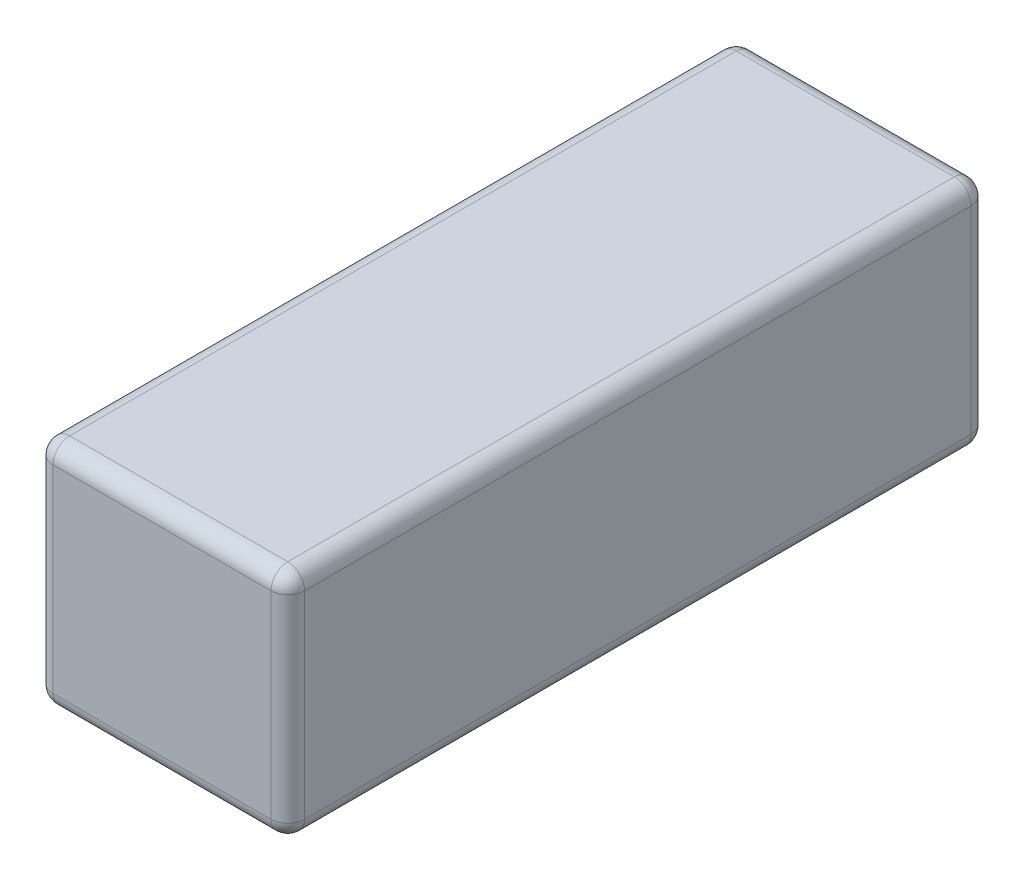
ISO-10303-21;
HEADER;
FILE_DESCRIPTION(('STEP AP214'),'2;1');
FILE_NAME('part.step','',(''),(''),'','','');
FILE_SCHEMA(('AUTOMOTIVE_DESIGN { 1 0 10303 214 1 1 1 1 }'));
ENDSEC;
DATA;
#1=APPLICATION_CONTEXT('core data for automotive mechanical design processes');
#2=APPLICATION_PROTOCOL_DEFINITION('international standard','automotive_design',2000,#1);
#3=PRODUCT_CONTEXT('',#1,'mechanical');
#4=PRODUCT('Part','Part','',(#3));
#5=PRODUCT_RELATED_PRODUCT_CATEGORY('part','',(#4));
#6=PRODUCT_DEFINITION_FORMATION('','',#4);
#7=PRODUCT_DEFINITION_CONTEXT('part definition',#1,'design');
#8=PRODUCT_DEFINITION('design','',#6,#7);
#9=PRODUCT_DEFINITION_SHAPE('','',#8);
#10=(LENGTH_UNIT() NAMED_UNIT(*) SI_UNIT(.MILLI.,.METRE.));
#11=(NAMED_UNIT(*) PLANE_ANGLE_UNIT() SI_UNIT($,.RADIAN.));
#12=(NAMED_UNIT(*) SI_UNIT($,.STERADIAN.) SOLID_ANGLE_UNIT());
#13=UNCERTAINTY_MEASURE_WITH_UNIT(LENGTH_MEASURE(1.E-05),#10,'distance_accuracy_value','');
#14=(GEOMETRIC_REPRESENTATION_CONTEXT(3) GLOBAL_UNCERTAINTY_ASSIGNED_CONTEXT((#13)) GLOBAL_UNIT_ASSIGNED_CONTEXT((#10,
#11,#12)) REPRESENTATION_CONTEXT('',''));
#15=CARTESIAN_POINT('',(0.,0.,0.));
#16=DIRECTION('',(0.,0.,1.));
#17=DIRECTION('',(1.,0.,0.));
#18=AXIS2_PLACEMENT_3D('',#15,#16,#17);
#19=CARTESIAN_POINT('',(-28.6254194503981,35.052,-12.73762683678));
#20=DIRECTION('',(1.,0.,0.));
#21=DIRECTION('',(0.,0.,-1.));
#22=AXIS2_PLACEMENT_3D('',#19,#20,#21);
#23=PLANE('',#22);
#24=DIRECTION('',(0.,0.,1.));
#25=VECTOR('',#24,1.);
#26=CARTESIAN_POINT('',(-28.6254194503981,2.54,-12.73762683678));
#27=LINE('',#26,#25);
#28=CARTESIAN_POINT('',(-28.6254194503981,2.54,-10.19762683678));
#29=VERTEX_POINT('',#28);
#30=CARTESIAN_POINT('',(-28.6254194503981,2.54,90.72237316322));
#31=VERTEX_POINT('',#30);
#32=EDGE_CURVE('E306',#29,#31,#27,.T.);
#33=ORIENTED_EDGE('',*,*,#32,.T.);
#34=DIRECTION('',(0.,-1.,0.));
#35=VECTOR('',#34,1.);
#36=CARTESIAN_POINT('',(-28.6254194503981,35.052,90.72237316322));
#37=LINE('',#36,#35);
#38=CARTESIAN_POINT('',(-28.6254194503981,32.512,90.72237316322));
#39=VERTEX_POINT('',#38);
#40=EDGE_CURVE('E310',#31,#39,#37,.F.);
#41=ORIENTED_EDGE('',*,*,#40,.T.);
#42=DIRECTION('',(0.,0.,1.));
#43=VECTOR('',#42,1.);
#44=CARTESIAN_POINT('',(-28.6254194503981,32.512,-12.73762683678));
#45=LINE('',#44,#43);
#46=CARTESIAN_POINT('',(-28.6254194503981,32.512,-10.19762683678));
#47=VERTEX_POINT('',#46);
#48=EDGE_CURVE('E299',#39,#47,#45,.F.);
#49=ORIENTED_EDGE('',*,*,#48,.T.);
#50=DIRECTION('',(0.,-1.,0.));
#51=VECTOR('',#50,1.);
#52=CARTESIAN_POINT('',(-28.6254194503981,35.052,-10.19762683678));
#53=LINE('',#52,#51);
#54=EDGE_CURVE('E307',#47,#29,#53,.T.);
#55=ORIENTED_EDGE('',*,*,#54,.T.);
#56=EDGE_LOOP('',(#33,#41,#49,#55));
#57=FACE_BOUND('',#56,.T.);
#58=ADVANCED_FACE('F49',(#57),#23,.F.);
#59=CARTESIAN_POINT('',(-28.6254194503981,35.052,93.26237316322));
#60=DIRECTION('',(0.,0.,-1.));
#61=DIRECTION('',(-1.,0.,0.));
#62=AXIS2_PLACEMENT_3D('',#59,#60,#61);
#63=PLANE('',#62);
#64=DIRECTION('',(1.,0.,0.));
#65=VECTOR('',#64,1.);
#66=CARTESIAN_POINT('',(-28.6254194503981,32.512,93.26237316322));
#67=LINE('',#66,#65);
#68=CARTESIAN_POINT('',(6.93458054960192,32.512,93.26237316322));
#69=VERTEX_POINT('',#68);
#70=CARTESIAN_POINT('',(-26.0854194503981,32.512,93.26237316322));
#71=VERTEX_POINT('',#70);
#72=EDGE_CURVE('E150',#69,#71,#67,.F.);
#73=ORIENTED_EDGE('',*,*,#72,.T.);
#74=DIRECTION('',(0.,-1.,0.));
#75=VECTOR('',#74,1.);
#76=CARTESIAN_POINT('',(-26.0854194503981,35.052,93.26237316322));
#77=LINE('',#76,#75);
#78=CARTESIAN_POINT('',(-26.0854194503981,2.54,93.26237316322));
#79=VERTEX_POINT('',#78);
#80=EDGE_CURVE('E145',#71,#79,#77,.T.);
#81=ORIENTED_EDGE('',*,*,#80,.T.);
#82=DIRECTION('',(1.,0.,0.));
#83=VECTOR('',#82,1.);
#84=CARTESIAN_POINT('',(-28.6254194503981,2.54,93.26237316322));
#85=LINE('',#84,#83);
#86=CARTESIAN_POINT('',(6.93458054960192,2.54,93.26237316322));
#87=VERTEX_POINT('',#86);
#88=EDGE_CURVE('E139',#79,#87,#85,.T.);
#89=ORIENTED_EDGE('',*,*,#88,.T.);
#90=DIRECTION('',(0.,-1.,0.));
#91=VECTOR('',#90,1.);
#92=CARTESIAN_POINT('',(6.93458054960192,35.052,93.26237316322));
#93=LINE('',#92,#91);
#94=EDGE_CURVE('E142',#87,#69,#93,.F.);
#95=ORIENTED_EDGE('',*,*,#94,.T.);
#96=EDGE_LOOP('',(#73,#81,#89,#95));
#97=FACE_BOUND('',#96,.T.);
#98=ADVANCED_FACE('F141',(#97),#63,.F.);
#99=CARTESIAN_POINT('',(9.47458054960191,35.052,-12.73762683678));
#100=DIRECTION('',(-1.,0.,0.));
#101=DIRECTION('',(0.,0.,1.));
#102=AXIS2_PLACEMENT_3D('',#99,#100,#101);
#103=PLANE('',#102);
#104=DIRECTION('',(0.,0.,-1.));
#105=VECTOR('',#104,1.);
#106=CARTESIAN_POINT('',(9.47458054960192,32.512,93.26237316322));
#107=LINE('',#106,#105);
#108=CARTESIAN_POINT('',(9.47458054960191,32.512,-10.19762683678));
#109=VERTEX_POINT('',#108);
#110=CARTESIAN_POINT('',(9.47458054960192,32.512,90.72237316322));
#111=VERTEX_POINT('',#110);
#112=EDGE_CURVE('E59',#109,#111,#107,.F.);
#113=ORIENTED_EDGE('',*,*,#112,.T.);
#114=DIRECTION('',(0.,-1.,0.));
#115=VECTOR('',#114,1.);
#116=CARTESIAN_POINT('',(9.47458054960192,35.052,90.72237316322));
#117=LINE('',#116,#115);
#118=CARTESIAN_POINT('',(9.47458054960192,2.54,90.72237316322));
#119=VERTEX_POINT('',#118);
#120=EDGE_CURVE('E11',#111,#119,#117,.T.);
#121=ORIENTED_EDGE('',*,*,#120,.T.);
#122=DIRECTION('',(0.,0.,-1.));
#123=VECTOR('',#122,1.);
#124=CARTESIAN_POINT('',(9.47458054960191,2.54,-12.73762683678));
#125=LINE('',#124,#123);
#126=CARTESIAN_POINT('',(9.47458054960191,2.54,-10.19762683678));
#127=VERTEX_POINT('',#126);
#128=EDGE_CURVE('E261',#119,#127,#125,.T.);
#129=ORIENTED_EDGE('',*,*,#128,.T.);
#130=DIRECTION('',(0.,-1.,0.));
#131=VECTOR('',#130,1.);
#132=CARTESIAN_POINT('',(9.47458054960191,35.052,-10.19762683678));
#133=LINE('',#132,#131);
#134=EDGE_CURVE('E70',#127,#109,#133,.F.);
#135=ORIENTED_EDGE('',*,*,#134,.T.);
#136=EDGE_LOOP('',(#113,#121,#129,#135));
#137=FACE_BOUND('',#136,.T.);
#138=ADVANCED_FACE('F391',(#137),#103,.F.);
#139=CARTESIAN_POINT('',(-28.6254194503981,35.052,-12.73762683678));
#140=DIRECTION('',(0.,0.,1.));
#141=DIRECTION('',(1.,0.,0.));
#142=AXIS2_PLACEMENT_3D('',#139,#140,#141);
#143=PLANE('',#142);
#144=DIRECTION('',(0.,-1.,0.));
#145=VECTOR('',#144,1.);
#146=CARTESIAN_POINT('',(-26.0854194503981,35.052,-12.73762683678));
#147=LINE('',#146,#145);
#148=CARTESIAN_POINT('',(-26.0854194503981,2.54,-12.73762683678));
#149=VERTEX_POINT('',#148);
#150=CARTESIAN_POINT('',(-26.0854194503981,32.512,-12.73762683678));
#151=VERTEX_POINT('',#150);
#152=EDGE_CURVE('E256',#149,#151,#147,.F.);
#153=ORIENTED_EDGE('',*,*,#152,.T.);
#154=DIRECTION('',(-1.,0.,0.));
#155=VECTOR('',#154,1.);
#156=CARTESIAN_POINT('',(9.47458054960191,32.512,-12.73762683678));
#157=LINE('',#156,#155);
#158=CARTESIAN_POINT('',(6.93458054960191,32.512,-12.73762683678));
#159=VERTEX_POINT('',#158);
#160=EDGE_CURVE('E253',#151,#159,#157,.F.);
#161=ORIENTED_EDGE('',*,*,#160,.T.);
#162=DIRECTION('',(0.,-1.,0.));
#163=VECTOR('',#162,1.);
#164=CARTESIAN_POINT('',(6.93458054960191,35.052,-12.73762683678));
#165=LINE('',#164,#163);
#166=CARTESIAN_POINT('',(6.93458054960191,2.54,-12.73762683678));
#167=VERTEX_POINT('',#166);
#168=EDGE_CURVE('E245',#159,#167,#165,.T.);
#169=ORIENTED_EDGE('',*,*,#168,.T.);
#170=DIRECTION('',(-1.,0.,0.));
#171=VECTOR('',#170,1.);
#172=CARTESIAN_POINT('',(-28.6254194503981,2.54,-12.73762683678));
#173=LINE('',#172,#171);
#174=EDGE_CURVE('E249',#167,#149,#173,.T.);
#175=ORIENTED_EDGE('',*,*,#174,.T.);
#176=EDGE_LOOP('',(#153,#161,#169,#175));
#177=FACE_BOUND('',#176,.T.);
#178=ADVANCED_FACE('F254',(#177),#143,.F.);
#179=CARTESIAN_POINT('',(0.,35.052,0.));
#180=DIRECTION('',(0.,1.,0.));
#181=DIRECTION('',(0.,0.,1.));
#182=AXIS2_PLACEMENT_3D('',#179,#180,#181);
#183=PLANE('',#182);
#184=DIRECTION('',(0.,0.,1.));
#185=VECTOR('',#184,1.);
#186=CARTESIAN_POINT('',(-26.0854194503981,35.052,93.26237316322));
#187=LINE('',#186,#185);
#188=CARTESIAN_POINT('',(-26.0854194503981,35.052,-10.19762683678));
#189=VERTEX_POINT('',#188);
#190=CARTESIAN_POINT('',(-26.0854194503981,35.052,90.72237316322));
#191=VERTEX_POINT('',#190);
#192=EDGE_CURVE('E337',#189,#191,#187,.T.);
#193=ORIENTED_EDGE('',*,*,#192,.T.);
#194=DIRECTION('',(1.,0.,0.));
#195=VECTOR('',#194,1.);
#196=CARTESIAN_POINT('',(9.47458054960192,35.052,90.72237316322));
#197=LINE('',#196,#195);
#198=CARTESIAN_POINT('',(6.93458054960192,35.052,90.72237316322));
#199=VERTEX_POINT('',#198);
#200=EDGE_CURVE('E250',#191,#199,#197,.T.);
#201=ORIENTED_EDGE('',*,*,#200,.T.);
#202=DIRECTION('',(0.,0.,-1.));
#203=VECTOR('',#202,1.);
#204=CARTESIAN_POINT('',(6.93458054960191,35.052,-12.73762683678));
#205=LINE('',#204,#203);
#206=CARTESIAN_POINT('',(6.93458054960191,35.052,-10.19762683678));
#207=VERTEX_POINT('',#206);
#208=EDGE_CURVE('E331',#199,#207,#205,.T.);
#209=ORIENTED_EDGE('',*,*,#208,.T.);
#210=DIRECTION('',(-1.,0.,0.));
#211=VECTOR('',#210,1.);
#212=CARTESIAN_POINT('',(-28.6254194503981,35.052,-10.19762683678));
#213=LINE('',#212,#211);
#214=EDGE_CURVE('E334',#207,#189,#213,.T.);
#215=ORIENTED_EDGE('',*,*,#214,.T.);
#216=EDGE_LOOP('',(#193,#201,#209,#215));
#217=FACE_BOUND('',#216,.T.);
#218=ADVANCED_FACE('F371',(#217),#183,.T.);
#219=CARTESIAN_POINT('',(0.,0.,0.));
#220=DIRECTION('',(0.,1.,0.));
#221=DIRECTION('',(0.,0.,1.));
#222=AXIS2_PLACEMENT_3D('',#219,#220,#221);
#223=PLANE('',#222);
#224=DIRECTION('',(0.,0.,-1.));
#225=VECTOR('',#224,1.);
#226=CARTESIAN_POINT('',(6.93458054960191,0.,0.));
#227=LINE('',#226,#225);
#228=CARTESIAN_POINT('',(6.93458054960191,0.,-10.19762683678));
#229=VERTEX_POINT('',#228);
#230=CARTESIAN_POINT('',(6.93458054960192,0.,90.72237316322));
#231=VERTEX_POINT('',#230);
#232=EDGE_CURVE('E316',#229,#231,#227,.F.);
#233=ORIENTED_EDGE('',*,*,#232,.T.);
#234=DIRECTION('',(1.,0.,0.));
#235=VECTOR('',#234,1.);
#236=CARTESIAN_POINT('',(0.,0.,90.72237316322));
#237=LINE('',#236,#235);
#238=CARTESIAN_POINT('',(-26.0854194503981,0.,90.72237316322));
#239=VERTEX_POINT('',#238);
#240=EDGE_CURVE('E174',#231,#239,#237,.F.);
#241=ORIENTED_EDGE('',*,*,#240,.T.);
#242=DIRECTION('',(0.,0.,1.));
#243=VECTOR('',#242,1.);
#244=CARTESIAN_POINT('',(-26.0854194503981,0.,0.));
#245=LINE('',#244,#243);
#246=CARTESIAN_POINT('',(-26.0854194503981,0.,-10.19762683678));
#247=VERTEX_POINT('',#246);
#248=EDGE_CURVE('E326',#239,#247,#245,.F.);
#249=ORIENTED_EDGE('',*,*,#248,.T.);
#250=DIRECTION('',(-1.,0.,0.));
#251=VECTOR('',#250,1.);
#252=CARTESIAN_POINT('',(0.,0.,-10.19762683678));
#253=LINE('',#252,#251);
#254=EDGE_CURVE('E320',#247,#229,#253,.F.);
#255=ORIENTED_EDGE('',*,*,#254,.T.);
#256=EDGE_LOOP('',(#233,#241,#249,#255));
#257=FACE_BOUND('',#256,.T.);
#258=ADVANCED_FACE('F539',(#257),#223,.F.);
#259=CARTESIAN_POINT('',(6.93458054960191,35.052,-10.19762683678));
#260=DIRECTION('',(0.,-1.,0.));
#261=DIRECTION('',(0.,0.,-1.));
#262=AXIS2_PLACEMENT_3D('',#259,#260,#261);
#263=CYLINDRICAL_SURFACE('',#262,2.54);
#264=CARTESIAN_POINT('',(6.93458054960191,32.512,-10.19762683678));
#265=DIRECTION('',(0.,1.,0.));
#266=DIRECTION('',(0.,0.,1.));
#267=AXIS2_PLACEMENT_3D('',#264,#265,#266);
#268=CIRCLE('',#267,2.54);
#269=EDGE_CURVE('E53',#109,#159,#268,.T.);
#270=ORIENTED_EDGE('',*,*,#269,.F.);
#271=ORIENTED_EDGE('',*,*,#134,.F.);
#272=CARTESIAN_POINT('',(6.93458054960191,2.54,-10.19762683678));
#273=DIRECTION('',(0.,-1.,0.));
#274=DIRECTION('',(0.,0.,-1.));
#275=AXIS2_PLACEMENT_3D('',#272,#273,#274);
#276=CIRCLE('',#275,2.54);
#277=EDGE_CURVE('E229',#167,#127,#276,.T.);
#278=ORIENTED_EDGE('',*,*,#277,.F.);
#279=ORIENTED_EDGE('',*,*,#168,.F.);
#280=EDGE_LOOP('',(#270,#271,#278,#279));
#281=FACE_BOUND('',#280,.T.);
#282=ADVANCED_FACE('F51',(#281),#263,.T.);
#283=CARTESIAN_POINT('',(6.93458054960191,32.512,-10.19762683678));
#284=DIRECTION('',(0.,0.,-1.));
#285=DIRECTION('',(-1.,0.,0.));
#286=AXIS2_PLACEMENT_3D('',#283,#284,#285);
#287=SPHERICAL_SURFACE('',#286,2.54);
#288=CARTESIAN_POINT('',(6.93458054960191,32.512,-10.19762683678));
#289=DIRECTION('',(0.,0.,-1.));
#290=DIRECTION('',(-1.,0.,0.));
#291=AXIS2_PLACEMENT_3D('',#288,#289,#290);
#292=CIRCLE('',#291,2.54);
#293=EDGE_CURVE('E223',#109,#207,#292,.F.);
#294=ORIENTED_EDGE('',*,*,#293,.F.);
#295=ORIENTED_EDGE('',*,*,#269,.T.);
#296=CARTESIAN_POINT('',(6.93458054960191,32.512,-10.19762683678));
#297=DIRECTION('',(1.,0.,0.));
#298=DIRECTION('',(0.,0.,-1.));
#299=AXIS2_PLACEMENT_3D('',#296,#297,#298);
#300=CIRCLE('',#299,2.54);
#301=EDGE_CURVE('E227',#207,#159,#300,.F.);
#302=ORIENTED_EDGE('',*,*,#301,.F.);
#303=EDGE_LOOP('',(#294,#295,#302));
#304=FACE_BOUND('',#303,.T.);
#305=ADVANCED_FACE('F242',(#304),#287,.T.);
#306=CARTESIAN_POINT('',(6.93458054960191,2.54,-10.19762683678));
#307=DIRECTION('',(1.,0.,0.));
#308=DIRECTION('',(0.,1.,0.));
#309=AXIS2_PLACEMENT_3D('',#306,#307,#308);
#310=SPHERICAL_SURFACE('',#309,2.54);
#311=CARTESIAN_POINT('',(6.93458054960191,2.54,-10.19762683678));
#312=DIRECTION('',(1.,0.,0.));
#313=DIRECTION('',(0.,0.,-1.));
#314=AXIS2_PLACEMENT_3D('',#311,#312,#313);
#315=CIRCLE('',#314,2.54);
#316=EDGE_CURVE('E215',#167,#229,#315,.F.);
#317=ORIENTED_EDGE('',*,*,#316,.F.);
#318=ORIENTED_EDGE('',*,*,#277,.T.);
#319=CARTESIAN_POINT('',(6.93458054960191,2.54,-10.19762683678));
#320=DIRECTION('',(0.,0.,-1.));
#321=DIRECTION('',(-1.,0.,0.));
#322=AXIS2_PLACEMENT_3D('',#319,#320,#321);
#323=CIRCLE('',#322,2.54);
#324=EDGE_CURVE('E219',#229,#127,#323,.F.);
#325=ORIENTED_EDGE('',*,*,#324,.F.);
#326=EDGE_LOOP('',(#317,#318,#325));
#327=FACE_BOUND('',#326,.T.);
#328=ADVANCED_FACE('F518',(#327),#310,.T.);
#329=CARTESIAN_POINT('',(0.,32.512,-10.19762683678));
#330=DIRECTION('',(1.,0.,0.));
#331=DIRECTION('',(0.,0.,-1.));
#332=AXIS2_PLACEMENT_3D('',#329,#330,#331);
#333=CYLINDRICAL_SURFACE('',#332,2.54);
#334=ORIENTED_EDGE('',*,*,#301,.T.);
#335=ORIENTED_EDGE('',*,*,#160,.F.);
#336=CARTESIAN_POINT('',(-26.0854194503981,32.512,-10.19762683678));
#337=DIRECTION('',(-1.,0.,0.));
#338=DIRECTION('',(0.,0.,1.));
#339=AXIS2_PLACEMENT_3D('',#336,#337,#338);
#340=CIRCLE('',#339,2.54);
#341=EDGE_CURVE('E207',#189,#151,#340,.T.);
#342=ORIENTED_EDGE('',*,*,#341,.F.);
#343=ORIENTED_EDGE('',*,*,#214,.F.);
#344=EDGE_LOOP('',(#334,#335,#342,#343));
#345=FACE_BOUND('',#344,.T.);
#346=ADVANCED_FACE('F373',(#345),#333,.T.);
#347=CARTESIAN_POINT('',(6.93458054960191,32.512,0.));
#348=DIRECTION('',(0.,0.,1.));
#349=DIRECTION('',(1.,0.,0.));
#350=AXIS2_PLACEMENT_3D('',#347,#348,#349);
#351=CYLINDRICAL_SURFACE('',#350,2.54);
#352=ORIENTED_EDGE('',*,*,#293,.T.);
#353=ORIENTED_EDGE('',*,*,#208,.F.);
#354=CARTESIAN_POINT('',(6.93458054960192,32.512,90.72237316322));
#355=DIRECTION('',(0.,0.,1.));
#356=DIRECTION('',(1.,0.,0.));
#357=AXIS2_PLACEMENT_3D('',#354,#355,#356);
#358=CIRCLE('',#357,2.54);
#359=EDGE_CURVE('E203',#111,#199,#358,.T.);
#360=ORIENTED_EDGE('',*,*,#359,.F.);
#361=ORIENTED_EDGE('',*,*,#112,.F.);
#362=EDGE_LOOP('',(#352,#353,#360,#361));
#363=FACE_BOUND('',#362,.T.);
#364=ADVANCED_FACE('F502',(#363),#351,.T.);
#365=CARTESIAN_POINT('',(6.93458054960192,35.052,90.72237316322));
#366=DIRECTION('',(0.,-1.,0.));
#367=DIRECTION('',(0.,0.,-1.));
#368=AXIS2_PLACEMENT_3D('',#365,#366,#367);
#369=CYLINDRICAL_SURFACE('',#368,2.54);
#370=CARTESIAN_POINT('',(6.93458054960192,2.54,90.72237316322));
#371=DIRECTION('',(0.,-1.,0.));
#372=DIRECTION('',(0.,0.,-1.));
#373=AXIS2_PLACEMENT_3D('',#370,#371,#372);
#374=CIRCLE('',#373,2.54);
#375=EDGE_CURVE('E156',#119,#87,#374,.T.);
#376=ORIENTED_EDGE('',*,*,#375,.F.);
#377=ORIENTED_EDGE('',*,*,#120,.F.);
#378=CARTESIAN_POINT('',(6.93458054960192,32.512,90.72237316322));
#379=DIRECTION('',(0.,1.,0.));
#380=DIRECTION('',(0.,0.,1.));
#381=AXIS2_PLACEMENT_3D('',#378,#379,#380);
#382=CIRCLE('',#381,2.54);
#383=EDGE_CURVE('E159',#69,#111,#382,.T.);
#384=ORIENTED_EDGE('',*,*,#383,.F.);
#385=ORIENTED_EDGE('',*,*,#94,.F.);
#386=EDGE_LOOP('',(#376,#377,#384,#385));
#387=FACE_BOUND('',#386,.T.);
#388=ADVANCED_FACE('F155',(#387),#369,.T.);
#389=CARTESIAN_POINT('',(6.93458054960191,2.54,-12.73762683678));
#390=DIRECTION('',(0.,0.,-1.));
#391=DIRECTION('',(-1.,0.,0.));
#392=AXIS2_PLACEMENT_3D('',#389,#390,#391);
#393=CYLINDRICAL_SURFACE('',#392,2.54);
#394=ORIENTED_EDGE('',*,*,#324,.T.);
#395=ORIENTED_EDGE('',*,*,#128,.F.);
#396=CARTESIAN_POINT('',(6.93458054960192,2.54,90.72237316322));
#397=DIRECTION('',(0.,0.,1.));
#398=DIRECTION('',(1.,0.,0.));
#399=AXIS2_PLACEMENT_3D('',#396,#397,#398);
#400=CIRCLE('',#399,2.54);
#401=EDGE_CURVE('E169',#231,#119,#400,.T.);
#402=ORIENTED_EDGE('',*,*,#401,.F.);
#403=ORIENTED_EDGE('',*,*,#232,.F.);
#404=EDGE_LOOP('',(#394,#395,#402,#403));
#405=FACE_BOUND('',#404,.T.);
#406=ADVANCED_FACE('F486',(#405),#393,.T.);
#407=CARTESIAN_POINT('',(-28.6254194503981,2.54,-10.19762683678));
#408=DIRECTION('',(-1.,0.,0.));
#409=DIRECTION('',(0.,0.,1.));
#410=AXIS2_PLACEMENT_3D('',#407,#408,#409);
#411=CYLINDRICAL_SURFACE('',#410,2.54);
#412=ORIENTED_EDGE('',*,*,#316,.T.);
#413=ORIENTED_EDGE('',*,*,#254,.F.);
#414=CARTESIAN_POINT('',(-26.0854194503981,2.54,-10.19762683678));
#415=DIRECTION('',(-1.,0.,0.));
#416=DIRECTION('',(0.,0.,1.));
#417=AXIS2_PLACEMENT_3D('',#414,#415,#416);
#418=CIRCLE('',#417,2.54);
#419=EDGE_CURVE('E195',#149,#247,#418,.T.);
#420=ORIENTED_EDGE('',*,*,#419,.F.);
#421=ORIENTED_EDGE('',*,*,#174,.F.);
#422=EDGE_LOOP('',(#412,#413,#420,#421));
#423=FACE_BOUND('',#422,.T.);
#424=ADVANCED_FACE('F351',(#423),#411,.T.);
#425=CARTESIAN_POINT('',(-26.0854194503981,35.052,-10.19762683678));
#426=DIRECTION('',(0.,-1.,0.));
#427=DIRECTION('',(0.,0.,-1.));
#428=AXIS2_PLACEMENT_3D('',#425,#426,#427);
#429=CYLINDRICAL_SURFACE('',#428,2.54);
#430=CARTESIAN_POINT('',(-26.0854194503981,32.512,-10.19762683678));
#431=DIRECTION('',(0.,1.,0.));
#432=DIRECTION('',(0.,0.,1.));
#433=AXIS2_PLACEMENT_3D('',#430,#431,#432);
#434=CIRCLE('',#433,2.54);
#435=EDGE_CURVE('E211',#151,#47,#434,.T.);
#436=ORIENTED_EDGE('',*,*,#435,.F.);
#437=ORIENTED_EDGE('',*,*,#152,.F.);
#438=CARTESIAN_POINT('',(-26.0854194503981,2.54,-10.19762683678));
#439=DIRECTION('',(0.,-1.,0.));
#440=DIRECTION('',(0.,0.,-1.));
#441=AXIS2_PLACEMENT_3D('',#438,#439,#440);
#442=CIRCLE('',#441,2.54);
#443=EDGE_CURVE('E191',#29,#149,#442,.T.);
#444=ORIENTED_EDGE('',*,*,#443,.F.);
#445=ORIENTED_EDGE('',*,*,#54,.F.);
#446=EDGE_LOOP('',(#436,#437,#444,#445));
#447=FACE_BOUND('',#446,.T.);
#448=ADVANCED_FACE('F348',(#447),#429,.T.);
#449=CARTESIAN_POINT('',(-26.0854194503981,32.512,-10.19762683678));
#450=DIRECTION('',(0.,0.,-1.));
#451=DIRECTION('',(-1.,0.,0.));
#452=AXIS2_PLACEMENT_3D('',#449,#450,#451);
#453=SPHERICAL_SURFACE('',#452,2.54);
#454=ORIENTED_EDGE('',*,*,#341,.T.);
#455=ORIENTED_EDGE('',*,*,#435,.T.);
#456=CARTESIAN_POINT('',(-26.0854194503981,32.512,-10.19762683678));
#457=DIRECTION('',(0.,0.,-1.));
#458=DIRECTION('',(-1.,0.,0.));
#459=AXIS2_PLACEMENT_3D('',#456,#457,#458);
#460=CIRCLE('',#459,2.54);
#461=EDGE_CURVE('E181',#189,#47,#460,.F.);
#462=ORIENTED_EDGE('',*,*,#461,.F.);
#463=EDGE_LOOP('',(#454,#455,#462));
#464=FACE_BOUND('',#463,.T.);
#465=ADVANCED_FACE('F375',(#464),#453,.T.);
#466=CARTESIAN_POINT('',(6.93458054960192,32.512,90.72237316322));
#467=DIRECTION('',(1.,0.,0.));
#468=DIRECTION('',(0.,0.,-1.));
#469=AXIS2_PLACEMENT_3D('',#466,#467,#468);
#470=SPHERICAL_SURFACE('',#469,2.54);
#471=ORIENTED_EDGE('',*,*,#383,.T.);
#472=ORIENTED_EDGE('',*,*,#359,.T.);
#473=CARTESIAN_POINT('',(6.93458054960192,32.512,90.72237316322));
#474=DIRECTION('',(1.,0.,0.));
#475=DIRECTION('',(0.,0.,-1.));
#476=AXIS2_PLACEMENT_3D('',#473,#474,#475);
#477=CIRCLE('',#476,2.54);
#478=EDGE_CURVE('E176',#69,#199,#477,.F.);
#479=ORIENTED_EDGE('',*,*,#478,.F.);
#480=EDGE_LOOP('',(#471,#472,#479));
#481=FACE_BOUND('',#480,.T.);
#482=ADVANCED_FACE('F377',(#481),#470,.T.);
#483=CARTESIAN_POINT('',(6.93458054960192,2.54,90.72237316322));
#484=DIRECTION('',(1.,0.,0.));
#485=DIRECTION('',(0.,1.,0.));
#486=AXIS2_PLACEMENT_3D('',#483,#484,#485);
#487=SPHERICAL_SURFACE('',#486,2.54);
#488=ORIENTED_EDGE('',*,*,#401,.T.);
#489=ORIENTED_EDGE('',*,*,#375,.T.);
#490=CARTESIAN_POINT('',(6.93458054960192,2.54,90.72237316322));
#491=DIRECTION('',(1.,0.,0.));
#492=DIRECTION('',(0.,0.,-1.));
#493=AXIS2_PLACEMENT_3D('',#490,#491,#492);
#494=CIRCLE('',#493,2.54);
#495=EDGE_CURVE('E166',#231,#87,#494,.F.);
#496=ORIENTED_EDGE('',*,*,#495,.F.);
#497=EDGE_LOOP('',(#488,#489,#496));
#498=FACE_BOUND('',#497,.T.);
#499=ADVANCED_FACE('F165',(#498),#487,.T.);
#500=CARTESIAN_POINT('',(-26.0854194503981,2.54,-10.19762683678));
#501=DIRECTION('',(0.,0.,-1.));
#502=DIRECTION('',(0.,1.,0.));
#503=AXIS2_PLACEMENT_3D('',#500,#501,#502);
#504=SPHERICAL_SURFACE('',#503,2.54);
#505=ORIENTED_EDGE('',*,*,#443,.T.);
#506=ORIENTED_EDGE('',*,*,#419,.T.);
#507=CARTESIAN_POINT('',(-26.0854194503981,2.54,-10.19762683678));
#508=DIRECTION('',(0.,0.,-1.));
#509=DIRECTION('',(-1.,0.,0.));
#510=AXIS2_PLACEMENT_3D('',#507,#508,#509);
#511=CIRCLE('',#510,2.54);
#512=EDGE_CURVE('E177',#29,#247,#511,.F.);
#513=ORIENTED_EDGE('',*,*,#512,.F.);
#514=EDGE_LOOP('',(#505,#506,#513));
#515=FACE_BOUND('',#514,.T.);
#516=ADVANCED_FACE('F353',(#515),#504,.T.);
#517=CARTESIAN_POINT('',(-26.0854194503981,32.512,0.));
#518=DIRECTION('',(0.,0.,-1.));
#519=DIRECTION('',(-1.,0.,0.));
#520=AXIS2_PLACEMENT_3D('',#517,#518,#519);
#521=CYLINDRICAL_SURFACE('',#520,2.54);
#522=ORIENTED_EDGE('',*,*,#461,.T.);
#523=ORIENTED_EDGE('',*,*,#48,.F.);
#524=CARTESIAN_POINT('',(-26.0854194503981,32.512,90.72237316322));
#525=DIRECTION('',(0.,0.,1.));
#526=DIRECTION('',(1.,0.,0.));
#527=AXIS2_PLACEMENT_3D('',#524,#525,#526);
#528=CIRCLE('',#527,2.54);
#529=EDGE_CURVE('E184',#191,#39,#528,.T.);
#530=ORIENTED_EDGE('',*,*,#529,.F.);
#531=ORIENTED_EDGE('',*,*,#192,.F.);
#532=EDGE_LOOP('',(#522,#523,#530,#531));
#533=FACE_BOUND('',#532,.T.);
#534=ADVANCED_FACE('F301',(#533),#521,.T.);
#535=CARTESIAN_POINT('',(0.,32.512,90.72237316322));
#536=DIRECTION('',(-1.,0.,0.));
#537=DIRECTION('',(0.,0.,1.));
#538=AXIS2_PLACEMENT_3D('',#535,#536,#537);
#539=CYLINDRICAL_SURFACE('',#538,2.54);
#540=ORIENTED_EDGE('',*,*,#478,.T.);
#541=ORIENTED_EDGE('',*,*,#200,.F.);
#542=CARTESIAN_POINT('',(-26.0854194503981,32.512,90.72237316322));
#543=DIRECTION('',(-1.,0.,0.));
#544=DIRECTION('',(0.,0.,1.));
#545=AXIS2_PLACEMENT_3D('',#542,#543,#544);
#546=CIRCLE('',#545,2.54);
#547=EDGE_CURVE('E286',#71,#191,#546,.T.);
#548=ORIENTED_EDGE('',*,*,#547,.F.);
#549=ORIENTED_EDGE('',*,*,#72,.F.);
#550=EDGE_LOOP('',(#540,#541,#548,#549));
#551=FACE_BOUND('',#550,.T.);
#552=ADVANCED_FACE('F369',(#551),#539,.T.);
#553=CARTESIAN_POINT('',(-28.6254194503981,2.54,90.72237316322));
#554=DIRECTION('',(1.,0.,0.));
#555=DIRECTION('',(0.,0.,-1.));
#556=AXIS2_PLACEMENT_3D('',#553,#554,#555);
#557=CYLINDRICAL_SURFACE('',#556,2.54);
#558=ORIENTED_EDGE('',*,*,#495,.T.);
#559=ORIENTED_EDGE('',*,*,#88,.F.);
#560=CARTESIAN_POINT('',(-26.0854194503981,2.54,90.72237316322));
#561=DIRECTION('',(-1.,0.,0.));
#562=DIRECTION('',(0.,0.,1.));
#563=AXIS2_PLACEMENT_3D('',#560,#561,#562);
#564=CIRCLE('',#563,2.54);
#565=EDGE_CURVE('E282',#239,#79,#564,.T.);
#566=ORIENTED_EDGE('',*,*,#565,.F.);
#567=ORIENTED_EDGE('',*,*,#240,.F.);
#568=EDGE_LOOP('',(#558,#559,#566,#567));
#569=FACE_BOUND('',#568,.T.);
#570=ADVANCED_FACE('F172',(#569),#557,.T.);
#571=CARTESIAN_POINT('',(-26.0854194503981,2.54,-12.73762683678));
#572=DIRECTION('',(0.,0.,1.));
#573=DIRECTION('',(1.,0.,0.));
#574=AXIS2_PLACEMENT_3D('',#571,#572,#573);
#575=CYLINDRICAL_SURFACE('',#574,2.54);
#576=ORIENTED_EDGE('',*,*,#512,.T.);
#577=ORIENTED_EDGE('',*,*,#248,.F.);
#578=CARTESIAN_POINT('',(-26.0854194503981,2.54,90.72237316322));
#579=DIRECTION('',(0.,0.,1.));
#580=DIRECTION('',(1.,0.,0.));
#581=AXIS2_PLACEMENT_3D('',#578,#579,#580);
#582=CIRCLE('',#581,2.54);
#583=EDGE_CURVE('E279',#31,#239,#582,.T.);
#584=ORIENTED_EDGE('',*,*,#583,.F.);
#585=ORIENTED_EDGE('',*,*,#32,.F.);
#586=EDGE_LOOP('',(#576,#577,#584,#585));
#587=FACE_BOUND('',#586,.T.);
#588=ADVANCED_FACE('F356',(#587),#575,.T.);
#589=CARTESIAN_POINT('',(-26.0854194503981,32.512,90.72237316322));
#590=DIRECTION('',(0.,1.,0.));
#591=DIRECTION('',(0.,0.,1.));
#592=AXIS2_PLACEMENT_3D('',#589,#590,#591);
#593=SPHERICAL_SURFACE('',#592,2.54);
#594=ORIENTED_EDGE('',*,*,#547,.T.);
#595=ORIENTED_EDGE('',*,*,#529,.T.);
#596=CARTESIAN_POINT('',(-26.0854194503981,32.512,90.72237316322));
#597=DIRECTION('',(0.,1.,0.));
#598=DIRECTION('',(0.,0.,1.));
#599=AXIS2_PLACEMENT_3D('',#596,#597,#598);
#600=CIRCLE('',#599,2.54);
#601=EDGE_CURVE('E276',#71,#39,#600,.F.);
#602=ORIENTED_EDGE('',*,*,#601,.F.);
#603=EDGE_LOOP('',(#594,#595,#602));
#604=FACE_BOUND('',#603,.T.);
#605=ADVANCED_FACE('F295',(#604),#593,.T.);
#606=CARTESIAN_POINT('',(-26.0854194503981,2.54,90.72237316322));
#607=DIRECTION('',(0.,-1.,0.));
#608=DIRECTION('',(0.,0.,-1.));
#609=AXIS2_PLACEMENT_3D('',#606,#607,#608);
#610=SPHERICAL_SURFACE('',#609,2.54);
#611=ORIENTED_EDGE('',*,*,#583,.T.);
#612=ORIENTED_EDGE('',*,*,#565,.T.);
#613=CARTESIAN_POINT('',(-26.0854194503981,2.54,90.72237316322));
#614=DIRECTION('',(0.,-1.,0.));
#615=DIRECTION('',(0.,0.,-1.));
#616=AXIS2_PLACEMENT_3D('',#613,#614,#615);
#617=CIRCLE('',#616,2.54);
#618=EDGE_CURVE('E273',#31,#79,#617,.F.);
#619=ORIENTED_EDGE('',*,*,#618,.F.);
#620=EDGE_LOOP('',(#611,#612,#619));
#621=FACE_BOUND('',#620,.T.);
#622=ADVANCED_FACE('F358',(#621),#610,.T.);
#623=CARTESIAN_POINT('',(-26.0854194503981,35.052,90.72237316322));
#624=DIRECTION('',(0.,-1.,0.));
#625=DIRECTION('',(0.,0.,-1.));
#626=AXIS2_PLACEMENT_3D('',#623,#624,#625);
#627=CYLINDRICAL_SURFACE('',#626,2.54);
#628=ORIENTED_EDGE('',*,*,#601,.T.);
#629=ORIENTED_EDGE('',*,*,#40,.F.);
#630=ORIENTED_EDGE('',*,*,#618,.T.);
#631=ORIENTED_EDGE('',*,*,#80,.F.);
#632=EDGE_LOOP('',(#628,#629,#630,#631));
#633=FACE_BOUND('',#632,.T.);
#634=ADVANCED_FACE('F359',(#633),#627,.T.);
#635=CLOSED_SHELL('',(#58,#98,#138,#178,#218,#258,#282,#305,#328,#346,#364,#388,#406,#424,#448,
#465,#482,#499,#516,#534,#552,#570,#588,#605,#622,#634));
#636=MANIFOLD_SOLID_BREP('B2',#635);
#637=ADVANCED_BREP_SHAPE_REPRESENTATION('',(#18,#636),#14);
#638=SHAPE_DEFINITION_REPRESENTATION(#9,#637);
ENDSEC;
END-ISO-10303-21;
